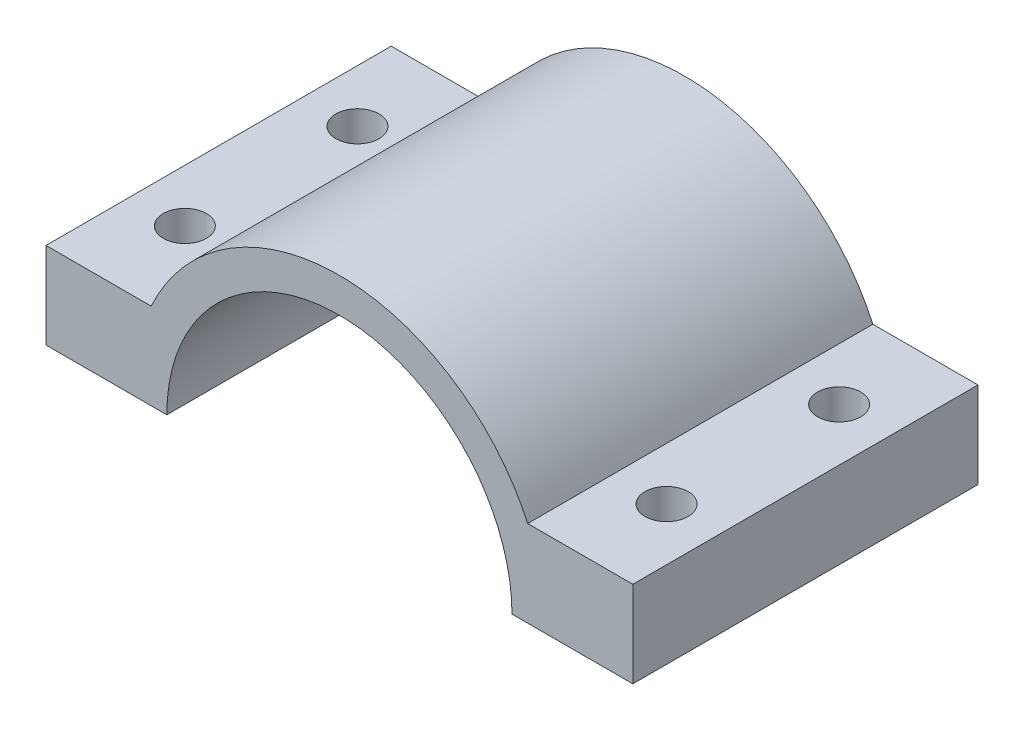
ISO-10303-21;
HEADER;
FILE_DESCRIPTION(('STEP AP214'),'2;1');
FILE_NAME('part.step','',(''),(''),'','','');
FILE_SCHEMA(('AUTOMOTIVE_DESIGN { 1 0 10303 214 1 1 1 1 }'));
ENDSEC;
DATA;
#1=APPLICATION_CONTEXT('core data for automotive mechanical design processes');
#2=APPLICATION_PROTOCOL_DEFINITION('international standard','automotive_design',2000,#1);
#3=PRODUCT_CONTEXT('',#1,'mechanical');
#4=PRODUCT('Part','Part','',(#3));
#5=PRODUCT_RELATED_PRODUCT_CATEGORY('part','',(#4));
#6=PRODUCT_DEFINITION_FORMATION('','',#4);
#7=PRODUCT_DEFINITION_CONTEXT('part definition',#1,'design');
#8=PRODUCT_DEFINITION('design','',#6,#7);
#9=PRODUCT_DEFINITION_SHAPE('','',#8);
#10=(LENGTH_UNIT() NAMED_UNIT(*) SI_UNIT(.MILLI.,.METRE.));
#11=(NAMED_UNIT(*) PLANE_ANGLE_UNIT() SI_UNIT($,.RADIAN.));
#12=(NAMED_UNIT(*) SI_UNIT($,.STERADIAN.) SOLID_ANGLE_UNIT());
#13=UNCERTAINTY_MEASURE_WITH_UNIT(LENGTH_MEASURE(1.E-05),#10,'distance_accuracy_value','');
#14=(GEOMETRIC_REPRESENTATION_CONTEXT(3) GLOBAL_UNCERTAINTY_ASSIGNED_CONTEXT((#13)) GLOBAL_UNIT_ASSIGNED_CONTEXT((#10,
#11,#12)) REPRESENTATION_CONTEXT('',''));
#15=CARTESIAN_POINT('',(0.,0.,0.));
#16=DIRECTION('',(0.,0.,1.));
#17=DIRECTION('',(1.,0.,0.));
#18=AXIS2_PLACEMENT_3D('',#15,#16,#17);
#19=CARTESIAN_POINT('',(0.,0.,0.));
#20=DIRECTION('',(0.,1.,0.));
#21=DIRECTION('',(0.,0.,1.));
#22=AXIS2_PLACEMENT_3D('',#19,#20,#21);
#23=PLANE('',#22);
#24=DIRECTION('',(0.,0.,-1.));
#25=VECTOR('',#24,1.);
#26=CARTESIAN_POINT('',(-20.,0.,40.));
#27=LINE('',#26,#25);
#28=CARTESIAN_POINT('',(-20.,0.,0.));
#29=VERTEX_POINT('',#28);
#30=CARTESIAN_POINT('',(-20.,0.,40.));
#31=VERTEX_POINT('',#30);
#32=EDGE_CURVE('E40',#29,#31,#27,.F.);
#33=ORIENTED_EDGE('',*,*,#32,.T.);
#34=DIRECTION('',(-1.,0.,0.));
#35=VECTOR('',#34,1.);
#36=CARTESIAN_POINT('',(0.,0.,40.));
#37=LINE('',#36,#35);
#38=CARTESIAN_POINT('',(-34.,0.,40.));
#39=VERTEX_POINT('',#38);
#40=EDGE_CURVE('E166',#31,#39,#37,.T.);
#41=ORIENTED_EDGE('',*,*,#40,.T.);
#42=DIRECTION('',(0.,0.,-1.));
#43=VECTOR('',#42,1.);
#44=CARTESIAN_POINT('',(-34.,0.,0.));
#45=LINE('',#44,#43);
#46=CARTESIAN_POINT('',(-34.,0.,0.));
#47=VERTEX_POINT('',#46);
#48=EDGE_CURVE('E163',#39,#47,#45,.T.);
#49=ORIENTED_EDGE('',*,*,#48,.T.);
#50=DIRECTION('',(-1.,0.,0.));
#51=VECTOR('',#50,1.);
#52=CARTESIAN_POINT('',(0.,0.,0.));
#53=LINE('',#52,#51);
#54=EDGE_CURVE('E161',#29,#47,#53,.T.);
#55=ORIENTED_EDGE('',*,*,#54,.F.);
#56=EDGE_LOOP('',(#33,#41,#49,#55));
#57=FACE_BOUND('',#56,.T.);
#58=CARTESIAN_POINT('',(-27.9087121146357,0.,30.));
#59=DIRECTION('',(0.,1.,0.));
#60=DIRECTION('',(0.,0.,1.));
#61=AXIS2_PLACEMENT_3D('',#58,#59,#60);
#62=CIRCLE('',#61,2.5);
#63=CARTESIAN_POINT('',(-27.9087121146357,0.,32.5));
#64=VERTEX_POINT('',#63);
#65=EDGE_CURVE('E158',#64,#64,#62,.F.);
#66=ORIENTED_EDGE('',*,*,#65,.F.);
#67=EDGE_LOOP('',(#66));
#68=FACE_BOUND('',#67,.T.);
#69=CARTESIAN_POINT('',(-27.9087121146357,0.,10.));
#70=DIRECTION('',(0.,1.,0.));
#71=DIRECTION('',(0.,0.,1.));
#72=AXIS2_PLACEMENT_3D('',#69,#70,#71);
#73=CIRCLE('',#72,2.5);
#74=CARTESIAN_POINT('',(-27.9087121146357,0.,12.5));
#75=VERTEX_POINT('',#74);
#76=EDGE_CURVE('E152',#75,#75,#73,.F.);
#77=ORIENTED_EDGE('',*,*,#76,.F.);
#78=EDGE_LOOP('',(#77));
#79=FACE_BOUND('',#78,.T.);
#80=ADVANCED_FACE('F37',(#57,#68,#79),#23,.F.);
#81=DIRECTION('',(0.,0.,-1.));
#82=VECTOR('',#81,1.);
#83=CARTESIAN_POINT('',(20.,0.,40.));
#84=LINE('',#83,#82);
#85=CARTESIAN_POINT('',(20.,0.,40.));
#86=VERTEX_POINT('',#85);
#87=CARTESIAN_POINT('',(20.,0.,0.));
#88=VERTEX_POINT('',#87);
#89=EDGE_CURVE('E169',#86,#88,#84,.T.);
#90=ORIENTED_EDGE('',*,*,#89,.T.);
#91=CARTESIAN_POINT('',(34.,0.,0.));
#92=VERTEX_POINT('',#91);
#93=EDGE_CURVE('E164',#92,#88,#53,.T.);
#94=ORIENTED_EDGE('',*,*,#93,.F.);
#95=DIRECTION('',(0.,0.,1.));
#96=VECTOR('',#95,1.);
#97=CARTESIAN_POINT('',(34.,0.,0.));
#98=LINE('',#97,#96);
#99=CARTESIAN_POINT('',(34.,0.,40.));
#100=VERTEX_POINT('',#99);
#101=EDGE_CURVE('E53',#92,#100,#98,.T.);
#102=ORIENTED_EDGE('',*,*,#101,.T.);
#103=EDGE_CURVE('E61',#100,#86,#37,.T.);
#104=ORIENTED_EDGE('',*,*,#103,.T.);
#105=EDGE_LOOP('',(#90,#94,#102,#104));
#106=FACE_BOUND('',#105,.T.);
#107=CARTESIAN_POINT('',(27.9087121146357,0.,30.));
#108=DIRECTION('',(0.,1.,0.));
#109=DIRECTION('',(0.,0.,1.));
#110=AXIS2_PLACEMENT_3D('',#107,#108,#109);
#111=CIRCLE('',#110,2.5);
#112=CARTESIAN_POINT('',(27.9087121146357,0.,32.5));
#113=VERTEX_POINT('',#112);
#114=EDGE_CURVE('E45',#113,#113,#111,.T.);
#115=ORIENTED_EDGE('',*,*,#114,.T.);
#116=EDGE_LOOP('',(#115));
#117=FACE_BOUND('',#116,.T.);
#118=CARTESIAN_POINT('',(27.9087121146357,0.,10.));
#119=DIRECTION('',(0.,1.,0.));
#120=DIRECTION('',(0.,0.,1.));
#121=AXIS2_PLACEMENT_3D('',#118,#119,#120);
#122=CIRCLE('',#121,2.5);
#123=CARTESIAN_POINT('',(27.9087121146357,0.,12.5));
#124=VERTEX_POINT('',#123);
#125=EDGE_CURVE('E11',#124,#124,#122,.T.);
#126=ORIENTED_EDGE('',*,*,#125,.T.);
#127=EDGE_LOOP('',(#126));
#128=FACE_BOUND('',#127,.T.);
#129=ADVANCED_FACE('F194',(#106,#117,#128),#23,.F.);
#130=CARTESIAN_POINT('',(0.,0.,40.));
#131=DIRECTION('',(0.,0.,-1.));
#132=DIRECTION('',(-1.,0.,0.));
#133=AXIS2_PLACEMENT_3D('',#130,#131,#132);
#134=CYLINDRICAL_SURFACE('',#133,24.);
#135=DIRECTION('',(0.,0.,-1.));
#136=VECTOR('',#135,1.);
#137=CARTESIAN_POINT('',(21.8174242292714,10.,40.));
#138=LINE('',#137,#136);
#139=CARTESIAN_POINT('',(21.8174242292714,10.,0.));
#140=VERTEX_POINT('',#139);
#141=CARTESIAN_POINT('',(21.8174242292714,10.,40.));
#142=VERTEX_POINT('',#141);
#143=EDGE_CURVE('E116',#140,#142,#138,.F.);
#144=ORIENTED_EDGE('',*,*,#143,.F.);
#145=CARTESIAN_POINT('',(0.,0.,0.));
#146=DIRECTION('',(0.,0.,1.));
#147=DIRECTION('',(1.,0.,0.));
#148=AXIS2_PLACEMENT_3D('',#145,#146,#147);
#149=CIRCLE('',#148,24.);
#150=CARTESIAN_POINT('',(-21.8174242292714,10.,0.));
#151=VERTEX_POINT('',#150);
#152=EDGE_CURVE('E144',#140,#151,#149,.T.);
#153=ORIENTED_EDGE('',*,*,#152,.T.);
#154=DIRECTION('',(0.,0.,-1.));
#155=VECTOR('',#154,1.);
#156=CARTESIAN_POINT('',(-21.8174242292714,10.,40.));
#157=LINE('',#156,#155);
#158=CARTESIAN_POINT('',(-21.8174242292714,10.,40.));
#159=VERTEX_POINT('',#158);
#160=EDGE_CURVE('E149',#151,#159,#157,.F.);
#161=ORIENTED_EDGE('',*,*,#160,.T.);
#162=CARTESIAN_POINT('',(0.,0.,40.));
#163=DIRECTION('',(0.,0.,1.));
#164=DIRECTION('',(1.,0.,0.));
#165=AXIS2_PLACEMENT_3D('',#162,#163,#164);
#166=CIRCLE('',#165,24.);
#167=EDGE_CURVE('E147',#142,#159,#166,.T.);
#168=ORIENTED_EDGE('',*,*,#167,.F.);
#169=EDGE_LOOP('',(#144,#153,#161,#168));
#170=FACE_BOUND('',#169,.T.);
#171=ADVANCED_FACE('F197',(#170),#134,.T.);
#172=CARTESIAN_POINT('',(0.,0.,40.));
#173=DIRECTION('',(0.,0.,1.));
#174=DIRECTION('',(1.,0.,0.));
#175=AXIS2_PLACEMENT_3D('',#172,#173,#174);
#176=PLANE('',#175);
#177=ORIENTED_EDGE('',*,*,#103,.F.);
#178=DIRECTION('',(0.,1.,0.));
#179=VECTOR('',#178,1.);
#180=CARTESIAN_POINT('',(34.,-10.,40.));
#181=LINE('',#180,#179);
#182=CARTESIAN_POINT('',(34.,10.,40.));
#183=VERTEX_POINT('',#182);
#184=EDGE_CURVE('E101',#100,#183,#181,.T.);
#185=ORIENTED_EDGE('',*,*,#184,.T.);
#186=DIRECTION('',(1.,0.,0.));
#187=VECTOR('',#186,1.);
#188=CARTESIAN_POINT('',(34.,10.,40.));
#189=LINE('',#188,#187);
#190=EDGE_CURVE('E104',#142,#183,#189,.T.);
#191=ORIENTED_EDGE('',*,*,#190,.F.);
#192=ORIENTED_EDGE('',*,*,#167,.T.);
#193=DIRECTION('',(1.,0.,0.));
#194=VECTOR('',#193,1.);
#195=CARTESIAN_POINT('',(-34.,10.,40.));
#196=LINE('',#195,#194);
#197=CARTESIAN_POINT('',(-34.,10.,40.));
#198=VERTEX_POINT('',#197);
#199=EDGE_CURVE('E133',#198,#159,#196,.T.);
#200=ORIENTED_EDGE('',*,*,#199,.F.);
#201=DIRECTION('',(0.,1.,0.));
#202=VECTOR('',#201,1.);
#203=CARTESIAN_POINT('',(-34.,-10.,40.));
#204=LINE('',#203,#202);
#205=EDGE_CURVE('E137',#39,#198,#204,.T.);
#206=ORIENTED_EDGE('',*,*,#205,.F.);
#207=ORIENTED_EDGE('',*,*,#40,.F.);
#208=CARTESIAN_POINT('',(0.,0.,40.));
#209=DIRECTION('',(0.,0.,1.));
#210=DIRECTION('',(1.,0.,0.));
#211=AXIS2_PLACEMENT_3D('',#208,#209,#210);
#212=CIRCLE('',#211,20.);
#213=EDGE_CURVE('E141',#86,#31,#212,.T.);
#214=ORIENTED_EDGE('',*,*,#213,.F.);
#215=EDGE_LOOP('',(#177,#185,#191,#192,#200,#206,#207,#214));
#216=FACE_BOUND('',#215,.T.);
#217=ADVANCED_FACE('F103',(#216),#176,.T.);
#218=CARTESIAN_POINT('',(0.,0.,0.));
#219=DIRECTION('',(0.,0.,1.));
#220=DIRECTION('',(1.,0.,0.));
#221=AXIS2_PLACEMENT_3D('',#218,#219,#220);
#222=PLANE('',#221);
#223=DIRECTION('',(0.,1.,0.));
#224=VECTOR('',#223,1.);
#225=CARTESIAN_POINT('',(34.,-10.,0.));
#226=LINE('',#225,#224);
#227=CARTESIAN_POINT('',(34.,10.,0.));
#228=VERTEX_POINT('',#227);
#229=EDGE_CURVE('E106',#92,#228,#226,.T.);
#230=ORIENTED_EDGE('',*,*,#229,.F.);
#231=ORIENTED_EDGE('',*,*,#93,.T.);
#232=CARTESIAN_POINT('',(0.,0.,0.));
#233=DIRECTION('',(0.,0.,1.));
#234=DIRECTION('',(1.,0.,0.));
#235=AXIS2_PLACEMENT_3D('',#232,#233,#234);
#236=CIRCLE('',#235,20.);
#237=EDGE_CURVE('E139',#88,#29,#236,.T.);
#238=ORIENTED_EDGE('',*,*,#237,.T.);
#239=ORIENTED_EDGE('',*,*,#54,.T.);
#240=DIRECTION('',(0.,1.,0.));
#241=VECTOR('',#240,1.);
#242=CARTESIAN_POINT('',(-34.,-10.,0.));
#243=LINE('',#242,#241);
#244=CARTESIAN_POINT('',(-34.,10.,0.));
#245=VERTEX_POINT('',#244);
#246=EDGE_CURVE('E136',#47,#245,#243,.T.);
#247=ORIENTED_EDGE('',*,*,#246,.T.);
#248=DIRECTION('',(-1.,0.,0.));
#249=VECTOR('',#248,1.);
#250=CARTESIAN_POINT('',(-20.,10.,0.));
#251=LINE('',#250,#249);
#252=EDGE_CURVE('E127',#151,#245,#251,.T.);
#253=ORIENTED_EDGE('',*,*,#252,.F.);
#254=ORIENTED_EDGE('',*,*,#152,.F.);
#255=DIRECTION('',(-1.,0.,0.));
#256=VECTOR('',#255,1.);
#257=CARTESIAN_POINT('',(20.,10.,0.));
#258=LINE('',#257,#256);
#259=EDGE_CURVE('E107',#228,#140,#258,.T.);
#260=ORIENTED_EDGE('',*,*,#259,.F.);
#261=EDGE_LOOP('',(#230,#231,#238,#239,#247,#253,#254,#260));
#262=FACE_BOUND('',#261,.T.);
#263=ADVANCED_FACE('F192',(#262),#222,.F.);
#264=CARTESIAN_POINT('',(0.,0.,40.));
#265=DIRECTION('',(0.,0.,-1.));
#266=DIRECTION('',(-1.,0.,0.));
#267=AXIS2_PLACEMENT_3D('',#264,#265,#266);
#268=CYLINDRICAL_SURFACE('',#267,20.);
#269=ORIENTED_EDGE('',*,*,#89,.F.);
#270=ORIENTED_EDGE('',*,*,#213,.T.);
#271=ORIENTED_EDGE('',*,*,#32,.F.);
#272=ORIENTED_EDGE('',*,*,#237,.F.);
#273=EDGE_LOOP('',(#269,#270,#271,#272));
#274=FACE_BOUND('',#273,.T.);
#275=ADVANCED_FACE('F181',(#274),#268,.F.);
#276=CARTESIAN_POINT('',(0.,10.,0.));
#277=DIRECTION('',(0.,1.,0.));
#278=DIRECTION('',(0.,0.,1.));
#279=AXIS2_PLACEMENT_3D('',#276,#277,#278);
#280=PLANE('',#279);
#281=CARTESIAN_POINT('',(-27.9087121146357,10.,10.));
#282=DIRECTION('',(0.,1.,0.));
#283=DIRECTION('',(0.,0.,1.));
#284=AXIS2_PLACEMENT_3D('',#281,#282,#283);
#285=CIRCLE('',#284,2.5);
#286=CARTESIAN_POINT('',(-27.9087121146357,10.,12.5));
#287=VERTEX_POINT('',#286);
#288=EDGE_CURVE('E117',#287,#287,#285,.T.);
#289=ORIENTED_EDGE('',*,*,#288,.F.);
#290=EDGE_LOOP('',(#289));
#291=FACE_BOUND('',#290,.T.);
#292=CARTESIAN_POINT('',(-27.9087121146357,10.,30.));
#293=DIRECTION('',(0.,1.,0.));
#294=DIRECTION('',(0.,0.,1.));
#295=AXIS2_PLACEMENT_3D('',#292,#293,#294);
#296=CIRCLE('',#295,2.5);
#297=CARTESIAN_POINT('',(-27.9087121146357,10.,32.5));
#298=VERTEX_POINT('',#297);
#299=EDGE_CURVE('E211',#298,#298,#296,.T.);
#300=ORIENTED_EDGE('',*,*,#299,.F.);
#301=EDGE_LOOP('',(#300));
#302=FACE_BOUND('',#301,.T.);
#303=ORIENTED_EDGE('',*,*,#160,.F.);
#304=ORIENTED_EDGE('',*,*,#252,.T.);
#305=DIRECTION('',(0.,0.,1.));
#306=VECTOR('',#305,1.);
#307=CARTESIAN_POINT('',(-34.,10.,0.));
#308=LINE('',#307,#306);
#309=EDGE_CURVE('E130',#245,#198,#308,.T.);
#310=ORIENTED_EDGE('',*,*,#309,.T.);
#311=ORIENTED_EDGE('',*,*,#199,.T.);
#312=EDGE_LOOP('',(#303,#304,#310,#311));
#313=FACE_BOUND('',#312,.T.);
#314=ADVANCED_FACE('F188',(#291,#302,#313),#280,.T.);
#315=CARTESIAN_POINT('',(-34.,-10.,0.));
#316=DIRECTION('',(-1.,0.,0.));
#317=DIRECTION('',(0.,0.,1.));
#318=AXIS2_PLACEMENT_3D('',#315,#316,#317);
#319=PLANE('',#318);
#320=ORIENTED_EDGE('',*,*,#48,.F.);
#321=ORIENTED_EDGE('',*,*,#205,.T.);
#322=ORIENTED_EDGE('',*,*,#309,.F.);
#323=ORIENTED_EDGE('',*,*,#246,.F.);
#324=EDGE_LOOP('',(#320,#321,#322,#323));
#325=FACE_BOUND('',#324,.T.);
#326=ADVANCED_FACE('F185',(#325),#319,.T.);
#327=CARTESIAN_POINT('',(0.,10.,0.));
#328=DIRECTION('',(0.,-1.,0.));
#329=DIRECTION('',(0.,0.,-1.));
#330=AXIS2_PLACEMENT_3D('',#327,#328,#329);
#331=PLANE('',#330);
#332=CARTESIAN_POINT('',(27.9087121146357,10.,10.));
#333=DIRECTION('',(0.,-1.,0.));
#334=DIRECTION('',(0.,0.,1.));
#335=AXIS2_PLACEMENT_3D('',#332,#333,#334);
#336=CIRCLE('',#335,2.5);
#337=CARTESIAN_POINT('',(27.9087121146357,10.,12.5));
#338=VERTEX_POINT('',#337);
#339=EDGE_CURVE('E209',#338,#338,#336,.T.);
#340=ORIENTED_EDGE('',*,*,#339,.T.);
#341=EDGE_LOOP('',(#340));
#342=FACE_BOUND('',#341,.T.);
#343=CARTESIAN_POINT('',(27.9087121146357,10.,30.));
#344=DIRECTION('',(0.,-1.,0.));
#345=DIRECTION('',(0.,0.,1.));
#346=AXIS2_PLACEMENT_3D('',#343,#344,#345);
#347=CIRCLE('',#346,2.5);
#348=CARTESIAN_POINT('',(27.9087121146357,10.,32.5));
#349=VERTEX_POINT('',#348);
#350=EDGE_CURVE('E212',#349,#349,#347,.T.);
#351=ORIENTED_EDGE('',*,*,#350,.T.);
#352=EDGE_LOOP('',(#351));
#353=FACE_BOUND('',#352,.T.);
#354=ORIENTED_EDGE('',*,*,#259,.T.);
#355=ORIENTED_EDGE('',*,*,#143,.T.);
#356=ORIENTED_EDGE('',*,*,#190,.T.);
#357=DIRECTION('',(0.,0.,-1.));
#358=VECTOR('',#357,1.);
#359=CARTESIAN_POINT('',(34.,10.,0.));
#360=LINE('',#359,#358);
#361=EDGE_CURVE('E114',#183,#228,#360,.T.);
#362=ORIENTED_EDGE('',*,*,#361,.T.);
#363=EDGE_LOOP('',(#354,#355,#356,#362));
#364=FACE_BOUND('',#363,.T.);
#365=ADVANCED_FACE('F113',(#342,#353,#364),#331,.F.);
#366=CARTESIAN_POINT('',(34.,-10.,0.));
#367=DIRECTION('',(1.,0.,0.));
#368=DIRECTION('',(0.,0.,-1.));
#369=AXIS2_PLACEMENT_3D('',#366,#367,#368);
#370=PLANE('',#369);
#371=ORIENTED_EDGE('',*,*,#101,.F.);
#372=ORIENTED_EDGE('',*,*,#229,.T.);
#373=ORIENTED_EDGE('',*,*,#361,.F.);
#374=ORIENTED_EDGE('',*,*,#184,.F.);
#375=EDGE_LOOP('',(#371,#372,#373,#374));
#376=FACE_BOUND('',#375,.T.);
#377=ADVANCED_FACE('F119',(#376),#370,.T.);
#378=CARTESIAN_POINT('',(-27.9087121146357,-24.001,30.));
#379=DIRECTION('',(0.,1.,0.));
#380=DIRECTION('',(0.,0.,1.));
#381=AXIS2_PLACEMENT_3D('',#378,#379,#380);
#382=CYLINDRICAL_SURFACE('',#381,2.5);
#383=ORIENTED_EDGE('',*,*,#65,.T.);
#384=EDGE_LOOP('',(#383));
#385=FACE_BOUND('',#384,.T.);
#386=ORIENTED_EDGE('',*,*,#299,.T.);
#387=EDGE_LOOP('',(#386));
#388=FACE_BOUND('',#387,.T.);
#389=ADVANCED_FACE('F228',(#385,#388),#382,.F.);
#390=CARTESIAN_POINT('',(-27.9087121146357,-24.001,10.));
#391=DIRECTION('',(0.,1.,0.));
#392=DIRECTION('',(0.,0.,1.));
#393=AXIS2_PLACEMENT_3D('',#390,#391,#392);
#394=CYLINDRICAL_SURFACE('',#393,2.5);
#395=ORIENTED_EDGE('',*,*,#76,.T.);
#396=EDGE_LOOP('',(#395));
#397=FACE_BOUND('',#396,.T.);
#398=ORIENTED_EDGE('',*,*,#288,.T.);
#399=EDGE_LOOP('',(#398));
#400=FACE_BOUND('',#399,.T.);
#401=ADVANCED_FACE('F221',(#397,#400),#394,.F.);
#402=CARTESIAN_POINT('',(27.9087121146357,-24.001,30.));
#403=DIRECTION('',(0.,1.,0.));
#404=DIRECTION('',(0.,0.,1.));
#405=AXIS2_PLACEMENT_3D('',#402,#403,#404);
#406=CYLINDRICAL_SURFACE('',#405,2.5);
#407=ORIENTED_EDGE('',*,*,#114,.F.);
#408=EDGE_LOOP('',(#407));
#409=FACE_BOUND('',#408,.T.);
#410=ORIENTED_EDGE('',*,*,#350,.F.);
#411=EDGE_LOOP('',(#410));
#412=FACE_BOUND('',#411,.T.);
#413=ADVANCED_FACE('F205',(#409,#412),#406,.F.);
#414=CARTESIAN_POINT('',(27.9087121146357,-24.001,10.));
#415=DIRECTION('',(0.,1.,0.));
#416=DIRECTION('',(0.,0.,1.));
#417=AXIS2_PLACEMENT_3D('',#414,#415,#416);
#418=CYLINDRICAL_SURFACE('',#417,2.5);
#419=ORIENTED_EDGE('',*,*,#125,.F.);
#420=EDGE_LOOP('',(#419));
#421=FACE_BOUND('',#420,.T.);
#422=ORIENTED_EDGE('',*,*,#339,.F.);
#423=EDGE_LOOP('',(#422));
#424=FACE_BOUND('',#423,.T.);
#425=ADVANCED_FACE('F198',(#421,#424),#418,.F.);
#426=CLOSED_SHELL('',(#80,#129,#171,#217,#263,#275,#314,#326,#365,#377,#389,#401,#413,#425));
#427=MANIFOLD_SOLID_BREP('B2',#426);
#428=ADVANCED_BREP_SHAPE_REPRESENTATION('',(#18,#427),#14);
#429=SHAPE_DEFINITION_REPRESENTATION(#9,#428);
ENDSEC;
END-ISO-10303-21;
